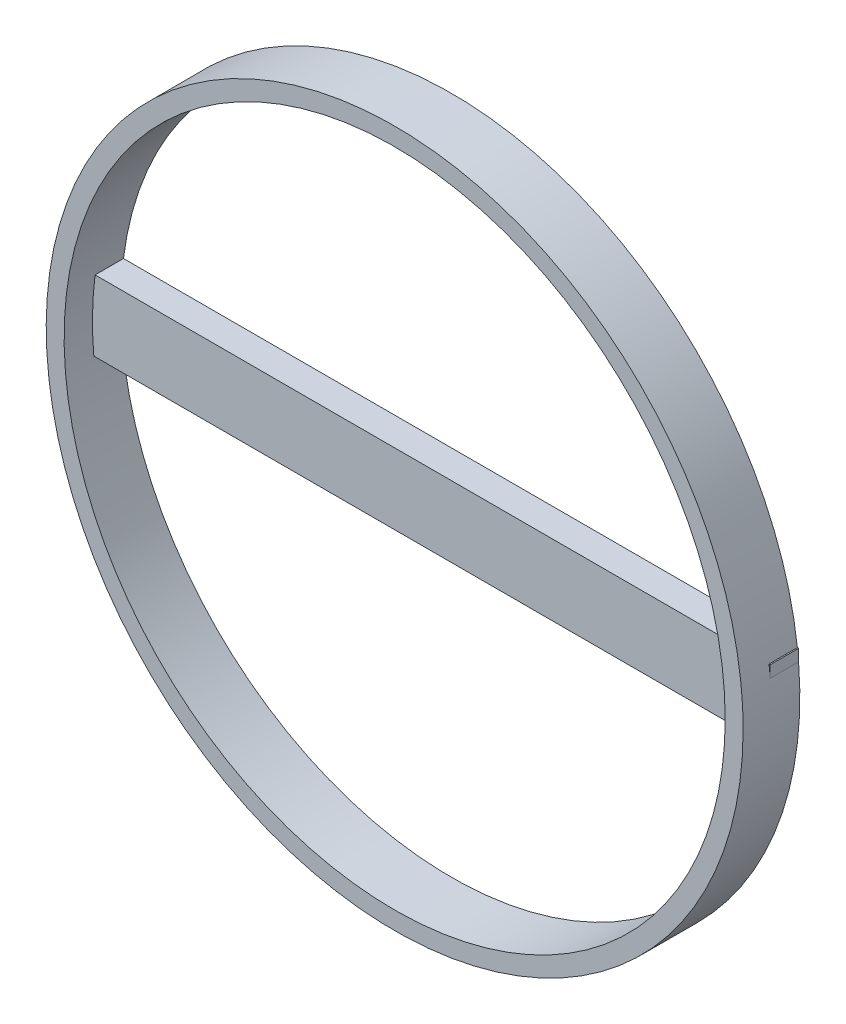
ISO-10303-21;
HEADER;
FILE_DESCRIPTION(('STEP AP214'),'2;1');
FILE_NAME('part.step','',(''),(''),'','','');
FILE_SCHEMA(('AUTOMOTIVE_DESIGN { 1 0 10303 214 1 1 1 1 }'));
ENDSEC;
DATA;
#1=APPLICATION_CONTEXT('core data for automotive mechanical design processes');
#2=APPLICATION_PROTOCOL_DEFINITION('international standard','automotive_design',2000,#1);
#3=PRODUCT_CONTEXT('',#1,'mechanical');
#4=PRODUCT('Part','Part','',(#3));
#5=PRODUCT_RELATED_PRODUCT_CATEGORY('part','',(#4));
#6=PRODUCT_DEFINITION_FORMATION('','',#4);
#7=PRODUCT_DEFINITION_CONTEXT('part definition',#1,'design');
#8=PRODUCT_DEFINITION('design','',#6,#7);
#9=PRODUCT_DEFINITION_SHAPE('','',#8);
#10=(LENGTH_UNIT() NAMED_UNIT(*) SI_UNIT(.MILLI.,.METRE.));
#11=(NAMED_UNIT(*) PLANE_ANGLE_UNIT() SI_UNIT($,.RADIAN.));
#12=(NAMED_UNIT(*) SI_UNIT($,.STERADIAN.) SOLID_ANGLE_UNIT());
#13=UNCERTAINTY_MEASURE_WITH_UNIT(LENGTH_MEASURE(1.E-05),#10,'distance_accuracy_value','');
#14=(GEOMETRIC_REPRESENTATION_CONTEXT(3) GLOBAL_UNCERTAINTY_ASSIGNED_CONTEXT((#13)) GLOBAL_UNIT_ASSIGNED_CONTEXT((#10,
#11,#12)) REPRESENTATION_CONTEXT('',''));
#15=CARTESIAN_POINT('',(0.,0.,0.));
#16=DIRECTION('',(0.,0.,1.));
#17=DIRECTION('',(1.,0.,0.));
#18=AXIS2_PLACEMENT_3D('',#15,#16,#17);
#19=CARTESIAN_POINT('',(0.,0.,4.));
#20=DIRECTION('',(0.,0.,-1.));
#21=DIRECTION('',(-1.,0.,0.));
#22=AXIS2_PLACEMENT_3D('',#19,#20,#21);
#23=CYLINDRICAL_SURFACE('',#22,23.3022945543986);
#24=CARTESIAN_POINT('',(0.,0.,4.));
#25=DIRECTION('',(0.,0.,1.));
#26=DIRECTION('',(1.,0.,0.));
#27=AXIS2_PLACEMENT_3D('',#24,#25,#26);
#28=CIRCLE('',#27,23.3022945543986);
#29=CARTESIAN_POINT('',(23.3022945543986,0.,4.));
#30=VERTEX_POINT('',#29);
#31=EDGE_CURVE('E129',#30,#30,#28,.T.);
#32=ORIENTED_EDGE('',*,*,#31,.T.);
#33=EDGE_LOOP('',(#32));
#34=FACE_BOUND('',#33,.T.);
#35=CARTESIAN_POINT('',(0.,0.,0.));
#36=DIRECTION('',(0.,0.,1.));
#37=DIRECTION('',(1.,0.,0.));
#38=AXIS2_PLACEMENT_3D('',#35,#36,#37);
#39=CIRCLE('',#38,23.3022945543986);
#40=CARTESIAN_POINT('',(-23.2088651594776,-2.08458857071179,0.));
#41=VERTEX_POINT('',#40);
#42=CARTESIAN_POINT('',(23.2088651594776,-2.08458857071179,0.));
#43=VERTEX_POINT('',#42);
#44=EDGE_CURVE('E128',#41,#43,#39,.T.);
#45=ORIENTED_EDGE('',*,*,#44,.F.);
#46=DIRECTION('',(0.,0.,-1.));
#47=VECTOR('',#46,1.);
#48=CARTESIAN_POINT('',(-23.2088651594776,-2.08458857071179,4.));
#49=LINE('',#48,#47);
#50=CARTESIAN_POINT('',(-23.2088651594776,-2.08458857071179,2.));
#51=VERTEX_POINT('',#50);
#52=EDGE_CURVE('E48',#41,#51,#49,.F.);
#53=ORIENTED_EDGE('',*,*,#52,.T.);
#54=CARTESIAN_POINT('',(0.,0.,2.));
#55=DIRECTION('',(0.,0.,1.));
#56=DIRECTION('',(1.,0.,0.));
#57=AXIS2_PLACEMENT_3D('',#54,#55,#56);
#58=CIRCLE('',#57,23.3022945543986);
#59=CARTESIAN_POINT('',(-23.1191978169211,2.91541142928821,2.));
#60=VERTEX_POINT('',#59);
#61=EDGE_CURVE('E143',#60,#51,#58,.T.);
#62=ORIENTED_EDGE('',*,*,#61,.F.);
#63=DIRECTION('',(0.,0.,-1.));
#64=VECTOR('',#63,1.);
#65=CARTESIAN_POINT('',(-23.1191978169211,2.91541142928821,4.));
#66=LINE('',#65,#64);
#67=CARTESIAN_POINT('',(-23.1191978169211,2.91541142928821,0.));
#68=VERTEX_POINT('',#67);
#69=EDGE_CURVE('E149',#68,#60,#66,.F.);
#70=ORIENTED_EDGE('',*,*,#69,.F.);
#71=CARTESIAN_POINT('',(23.1191978169211,2.91541142928821,0.));
#72=VERTEX_POINT('',#71);
#73=EDGE_CURVE('E133',#72,#68,#39,.T.);
#74=ORIENTED_EDGE('',*,*,#73,.F.);
#75=DIRECTION('',(0.,0.,-1.));
#76=VECTOR('',#75,1.);
#77=CARTESIAN_POINT('',(23.1191978169211,2.91541142928821,4.));
#78=LINE('',#77,#76);
#79=CARTESIAN_POINT('',(23.1191978169211,2.91541142928821,2.));
#80=VERTEX_POINT('',#79);
#81=EDGE_CURVE('E142',#80,#72,#78,.T.);
#82=ORIENTED_EDGE('',*,*,#81,.F.);
#83=CARTESIAN_POINT('',(23.2088651594776,-2.08458857071179,2.));
#84=VERTEX_POINT('',#83);
#85=EDGE_CURVE('E139',#84,#80,#58,.T.);
#86=ORIENTED_EDGE('',*,*,#85,.F.);
#87=DIRECTION('',(0.,0.,-1.));
#88=VECTOR('',#87,1.);
#89=CARTESIAN_POINT('',(23.2088651594776,-2.08458857071179,4.));
#90=LINE('',#89,#88);
#91=EDGE_CURVE('E146',#84,#43,#90,.T.);
#92=ORIENTED_EDGE('',*,*,#91,.T.);
#93=EDGE_LOOP('',(#45,#53,#62,#70,#74,#82,#86,#92));
#94=FACE_BOUND('',#93,.T.);
#95=ADVANCED_FACE('F40',(#34,#94),#23,.F.);
#96=CARTESIAN_POINT('',(0.,0.,4.));
#97=DIRECTION('',(0.,0.,1.));
#98=DIRECTION('',(1.,0.,0.));
#99=AXIS2_PLACEMENT_3D('',#96,#97,#98);
#100=PLANE('',#99);
#101=CARTESIAN_POINT('',(0.,0.,4.));
#102=DIRECTION('',(0.,0.,1.));
#103=DIRECTION('',(1.,0.,0.));
#104=AXIS2_PLACEMENT_3D('',#101,#102,#103);
#105=CIRCLE('',#104,24.565);
#106=CARTESIAN_POINT('',(24.565,0.,4.));
#107=VERTEX_POINT('',#106);
#108=EDGE_CURVE('E136',#107,#107,#105,.T.);
#109=ORIENTED_EDGE('',*,*,#108,.T.);
#110=EDGE_LOOP('',(#109));
#111=FACE_BOUND('',#110,.T.);
#112=ORIENTED_EDGE('',*,*,#31,.F.);
#113=EDGE_LOOP('',(#112));
#114=FACE_BOUND('',#113,.T.);
#115=ADVANCED_FACE('F172',(#111,#114),#100,.T.);
#116=CARTESIAN_POINT('',(0.,0.,0.));
#117=DIRECTION('',(0.,0.,1.));
#118=DIRECTION('',(1.,0.,0.));
#119=AXIS2_PLACEMENT_3D('',#116,#117,#118);
#120=PLANE('',#119);
#121=DIRECTION('',(0.,-1.,0.));
#122=VECTOR('',#121,1.);
#123=CARTESIAN_POINT('',(24.476390981737,2.91541142928821,0.));
#124=LINE('',#123,#122);
#125=CARTESIAN_POINT('',(24.476390981737,2.91541142928821,0.));
#126=VERTEX_POINT('',#125);
#127=CARTESIAN_POINT('',(24.476390981737,2.08458857071178,0.));
#128=VERTEX_POINT('',#127);
#129=EDGE_CURVE('E112',#126,#128,#124,.T.);
#130=ORIENTED_EDGE('',*,*,#129,.T.);
#131=CARTESIAN_POINT('',(0.,0.,0.));
#132=DIRECTION('',(0.,0.,1.));
#133=DIRECTION('',(1.,0.,0.));
#134=AXIS2_PLACEMENT_3D('',#131,#132,#133);
#135=CIRCLE('',#134,24.565);
#136=CARTESIAN_POINT('',(24.3913837491434,2.91541142928821,0.));
#137=VERTEX_POINT('',#136);
#138=EDGE_CURVE('E132',#137,#128,#135,.T.);
#139=ORIENTED_EDGE('',*,*,#138,.F.);
#140=DIRECTION('',(1.,0.,0.));
#141=VECTOR('',#140,1.);
#142=CARTESIAN_POINT('',(-24.3913837491434,2.91541142928821,0.));
#143=LINE('',#142,#141);
#144=EDGE_CURVE('E124',#137,#126,#143,.T.);
#145=ORIENTED_EDGE('',*,*,#144,.T.);
#146=EDGE_LOOP('',(#130,#139,#145));
#147=FACE_BOUND('',#146,.T.);
#148=ORIENTED_EDGE('',*,*,#44,.T.);
#149=DIRECTION('',(1.,0.,0.));
#150=VECTOR('',#149,1.);
#151=CARTESIAN_POINT('',(-24.3913837491434,-2.08458857071179,0.));
#152=LINE('',#151,#150);
#153=EDGE_CURVE('E121',#41,#43,#152,.T.);
#154=ORIENTED_EDGE('',*,*,#153,.F.);
#155=EDGE_LOOP('',(#148,#154));
#156=FACE_BOUND('',#155,.T.);
#157=EDGE_CURVE('E118',#68,#72,#143,.T.);
#158=ORIENTED_EDGE('',*,*,#157,.T.);
#159=ORIENTED_EDGE('',*,*,#73,.T.);
#160=EDGE_LOOP('',(#158,#159));
#161=FACE_BOUND('',#160,.T.);
#162=ADVANCED_FACE('F170',(#147,#156,#161),#120,.F.);
#163=CARTESIAN_POINT('',(0.,0.,4.));
#164=DIRECTION('',(0.,0.,-1.));
#165=DIRECTION('',(-1.,0.,0.));
#166=AXIS2_PLACEMENT_3D('',#163,#164,#165);
#167=CYLINDRICAL_SURFACE('',#166,24.565);
#168=ORIENTED_EDGE('',*,*,#138,.T.);
#169=DIRECTION('',(0.,0.,-1.));
#170=VECTOR('',#169,1.);
#171=CARTESIAN_POINT('',(24.476390981737,2.08458857071178,4.));
#172=LINE('',#171,#170);
#173=CARTESIAN_POINT('',(24.476390981737,2.08458857071178,2.));
#174=VERTEX_POINT('',#173);
#175=EDGE_CURVE('E11',#128,#174,#172,.F.);
#176=ORIENTED_EDGE('',*,*,#175,.T.);
#177=CARTESIAN_POINT('',(0.,0.,2.));
#178=DIRECTION('',(0.,0.,1.));
#179=DIRECTION('',(1.,0.,0.));
#180=AXIS2_PLACEMENT_3D('',#177,#178,#179);
#181=CIRCLE('',#180,24.565);
#182=CARTESIAN_POINT('',(24.3913837491434,2.91541142928821,2.));
#183=VERTEX_POINT('',#182);
#184=EDGE_CURVE('E54',#174,#183,#181,.T.);
#185=ORIENTED_EDGE('',*,*,#184,.T.);
#186=DIRECTION('',(0.,0.,-1.));
#187=VECTOR('',#186,1.);
#188=CARTESIAN_POINT('',(24.3913837491434,2.91541142928821,4.));
#189=LINE('',#188,#187);
#190=EDGE_CURVE('E102',#183,#137,#189,.T.);
#191=ORIENTED_EDGE('',*,*,#190,.T.);
#192=EDGE_LOOP('',(#168,#176,#185,#191));
#193=FACE_BOUND('',#192,.T.);
#194=ORIENTED_EDGE('',*,*,#108,.F.);
#195=EDGE_LOOP('',(#194));
#196=FACE_BOUND('',#195,.T.);
#197=ADVANCED_FACE('F42',(#193,#196),#167,.T.);
#198=CARTESIAN_POINT('',(0.,0.,2.));
#199=DIRECTION('',(0.,0.,1.));
#200=DIRECTION('',(1.,0.,0.));
#201=AXIS2_PLACEMENT_3D('',#198,#199,#200);
#202=PLANE('',#201);
#203=DIRECTION('',(1.,0.,0.));
#204=VECTOR('',#203,1.);
#205=CARTESIAN_POINT('',(-24.3913837491434,2.91541142928821,2.));
#206=LINE('',#205,#204);
#207=EDGE_CURVE('E105',#60,#80,#206,.T.);
#208=ORIENTED_EDGE('',*,*,#207,.F.);
#209=ORIENTED_EDGE('',*,*,#61,.T.);
#210=DIRECTION('',(1.,0.,0.));
#211=VECTOR('',#210,1.);
#212=CARTESIAN_POINT('',(-24.3913837491434,-2.08458857071179,2.));
#213=LINE('',#212,#211);
#214=EDGE_CURVE('E115',#51,#84,#213,.T.);
#215=ORIENTED_EDGE('',*,*,#214,.T.);
#216=ORIENTED_EDGE('',*,*,#85,.T.);
#217=EDGE_LOOP('',(#208,#209,#215,#216));
#218=FACE_BOUND('',#217,.T.);
#219=ADVANCED_FACE('F163',(#218),#202,.T.);
#220=CARTESIAN_POINT('',(-24.3913837491434,2.91541142928821,2.));
#221=DIRECTION('',(0.,1.,0.));
#222=DIRECTION('',(0.,0.,1.));
#223=AXIS2_PLACEMENT_3D('',#220,#221,#222);
#224=PLANE('',#223);
#225=ORIENTED_EDGE('',*,*,#207,.T.);
#226=ORIENTED_EDGE('',*,*,#81,.T.);
#227=ORIENTED_EDGE('',*,*,#157,.F.);
#228=ORIENTED_EDGE('',*,*,#69,.T.);
#229=EDGE_LOOP('',(#225,#226,#227,#228));
#230=FACE_BOUND('',#229,.T.);
#231=ADVANCED_FACE('F168',(#230),#224,.T.);
#232=CARTESIAN_POINT('',(-24.3913837491434,-2.08458857071179,2.));
#233=DIRECTION('',(0.,1.,0.));
#234=DIRECTION('',(0.,0.,1.));
#235=AXIS2_PLACEMENT_3D('',#232,#233,#234);
#236=PLANE('',#235);
#237=ORIENTED_EDGE('',*,*,#91,.F.);
#238=ORIENTED_EDGE('',*,*,#214,.F.);
#239=ORIENTED_EDGE('',*,*,#52,.F.);
#240=ORIENTED_EDGE('',*,*,#153,.T.);
#241=EDGE_LOOP('',(#237,#238,#239,#240));
#242=FACE_BOUND('',#241,.T.);
#243=ADVANCED_FACE('F159',(#242),#236,.F.);
#244=CARTESIAN_POINT('',(24.476390981737,2.91541142928821,2.));
#245=DIRECTION('',(1.,0.,0.));
#246=DIRECTION('',(0.,1.,0.));
#247=AXIS2_PLACEMENT_3D('',#244,#245,#246);
#248=PLANE('',#247);
#249=ORIENTED_EDGE('',*,*,#175,.F.);
#250=ORIENTED_EDGE('',*,*,#129,.F.);
#251=DIRECTION('',(0.,0.,-1.));
#252=VECTOR('',#251,1.);
#253=CARTESIAN_POINT('',(24.476390981737,2.91541142928821,2.));
#254=LINE('',#253,#252);
#255=CARTESIAN_POINT('',(24.476390981737,2.91541142928821,2.));
#256=VERTEX_POINT('',#255);
#257=EDGE_CURVE('E100',#256,#126,#254,.T.);
#258=ORIENTED_EDGE('',*,*,#257,.F.);
#259=DIRECTION('',(0.,-1.,0.));
#260=VECTOR('',#259,1.);
#261=CARTESIAN_POINT('',(24.476390981737,2.91541142928821,2.));
#262=LINE('',#261,#260);
#263=EDGE_CURVE('E106',#256,#174,#262,.T.);
#264=ORIENTED_EDGE('',*,*,#263,.T.);
#265=EDGE_LOOP('',(#249,#250,#258,#264));
#266=FACE_BOUND('',#265,.T.);
#267=ADVANCED_FACE('F110',(#266),#248,.T.);
#268=ORIENTED_EDGE('',*,*,#190,.F.);
#269=EDGE_CURVE('E96',#183,#256,#206,.T.);
#270=ORIENTED_EDGE('',*,*,#269,.T.);
#271=ORIENTED_EDGE('',*,*,#257,.T.);
#272=ORIENTED_EDGE('',*,*,#144,.F.);
#273=EDGE_LOOP('',(#268,#270,#271,#272));
#274=FACE_BOUND('',#273,.T.);
#275=ADVANCED_FACE('F98',(#274),#224,.T.);
#276=ORIENTED_EDGE('',*,*,#184,.F.);
#277=ORIENTED_EDGE('',*,*,#263,.F.);
#278=ORIENTED_EDGE('',*,*,#269,.F.);
#279=EDGE_LOOP('',(#276,#277,#278));
#280=FACE_BOUND('',#279,.T.);
#281=ADVANCED_FACE('F114',(#280),#202,.T.);
#282=CLOSED_SHELL('',(#95,#115,#162,#197,#219,#231,#243,#267,#275,#281));
#283=MANIFOLD_SOLID_BREP('B2',#282);
#284=ADVANCED_BREP_SHAPE_REPRESENTATION('',(#18,#283),#14);
#285=SHAPE_DEFINITION_REPRESENTATION(#9,#284);
ENDSEC;
END-ISO-10303-21;
